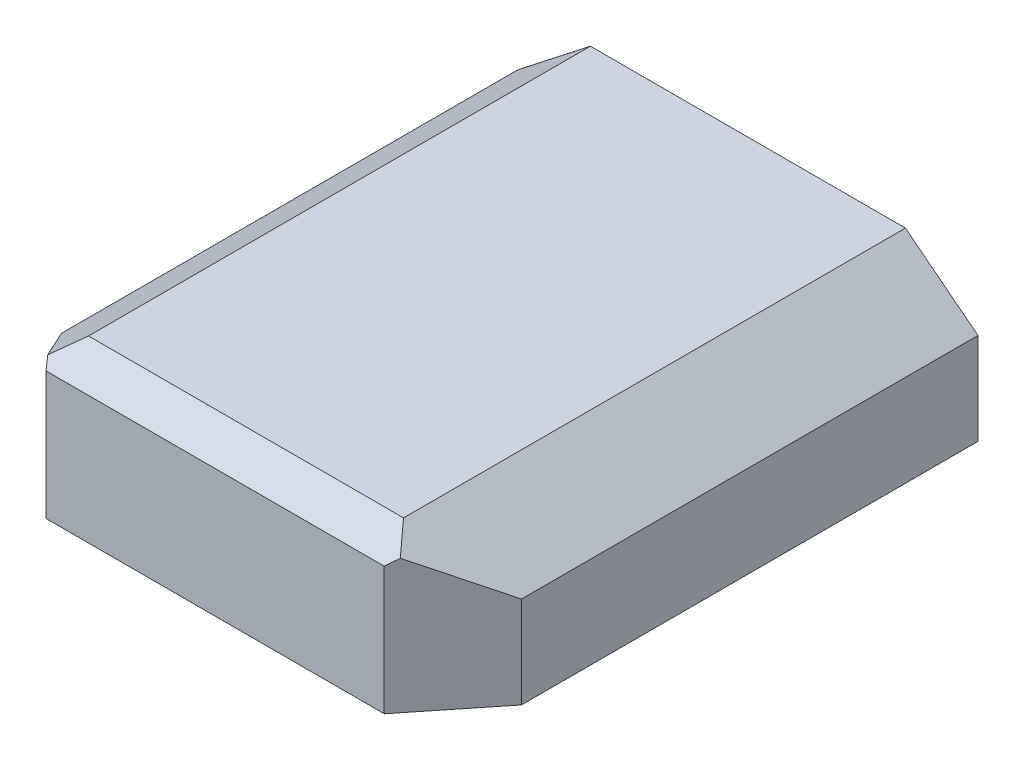
ISO-10303-21;
HEADER;
FILE_DESCRIPTION(('STEP AP214'),'2;1');
FILE_NAME('part.step','',(''),(''),'','','');
FILE_SCHEMA(('AUTOMOTIVE_DESIGN { 1 0 10303 214 1 1 1 1 }'));
ENDSEC;
DATA;
#1=APPLICATION_CONTEXT('core data for automotive mechanical design processes');
#2=APPLICATION_PROTOCOL_DEFINITION('international standard','automotive_design',2000,#1);
#3=PRODUCT_CONTEXT('',#1,'mechanical');
#4=PRODUCT('Part','Part','',(#3));
#5=PRODUCT_RELATED_PRODUCT_CATEGORY('part','',(#4));
#6=PRODUCT_DEFINITION_FORMATION('','',#4);
#7=PRODUCT_DEFINITION_CONTEXT('part definition',#1,'design');
#8=PRODUCT_DEFINITION('design','',#6,#7);
#9=PRODUCT_DEFINITION_SHAPE('','',#8);
#10=(LENGTH_UNIT() NAMED_UNIT(*) SI_UNIT(.MILLI.,.METRE.));
#11=(NAMED_UNIT(*) PLANE_ANGLE_UNIT() SI_UNIT($,.RADIAN.));
#12=(NAMED_UNIT(*) SI_UNIT($,.STERADIAN.) SOLID_ANGLE_UNIT());
#13=UNCERTAINTY_MEASURE_WITH_UNIT(LENGTH_MEASURE(1.E-05),#10,'distance_accuracy_value','');
#14=(GEOMETRIC_REPRESENTATION_CONTEXT(3) GLOBAL_UNCERTAINTY_ASSIGNED_CONTEXT((#13)) GLOBAL_UNIT_ASSIGNED_CONTEXT((#10,
#11,#12)) REPRESENTATION_CONTEXT('',''));
#15=CARTESIAN_POINT('',(0.,0.,0.));
#16=DIRECTION('',(0.,0.,1.));
#17=DIRECTION('',(1.,0.,0.));
#18=AXIS2_PLACEMENT_3D('',#15,#16,#17);
#19=CARTESIAN_POINT('',(-55.8644439331409,39.7381544763765,166.540565478371));
#20=DIRECTION('',(0.,-0.554700196225229,0.832050294337843));
#21=DIRECTION('',(0.,-0.832050294337843,-0.554700196225229));
#22=AXIS2_PLACEMENT_3D('',#19,#20,#21);
#23=PLANE('',#22);
#24=DIRECTION('',(-0.570340989878508,0.683452794913705,0.455635196609138));
#25=VECTOR('',#24,1.);
#26=CARTESIAN_POINT('',(-54.4589959227059,40.5501245133977,167.081878836385));
#27=LINE('',#26,#25);
#28=CARTESIAN_POINT('',(-55.858603187478,42.2273062588195,168.2));
#29=VERTEX_POINT('',#28);
#30=CARTESIAN_POINT('',(-55.8644439331409,42.2343053593901,168.204666067047));
#31=VERTEX_POINT('',#30);
#32=EDGE_CURVE('E308',#29,#31,#27,.T.);
#33=ORIENTED_EDGE('',*,*,#32,.F.);
#34=DIRECTION('',(1.,0.,0.));
#35=VECTOR('',#34,1.);
#36=CARTESIAN_POINT('',(-55.8644439331409,42.2273062588195,168.2));
#37=LINE('',#36,#35);
#38=CARTESIAN_POINT('',(55.8586031874781,42.2273062588196,168.2));
#39=VERTEX_POINT('',#38);
#40=EDGE_CURVE('E274',#29,#39,#37,.T.);
#41=ORIENTED_EDGE('',*,*,#40,.T.);
#42=DIRECTION('',(-0.570340989878508,-0.683452794913706,-0.455635196609137));
#43=VECTOR('',#42,1.);
#44=CARTESIAN_POINT('',(18.1148350650901,-3.00192374850611,138.047179995116));
#45=LINE('',#44,#43);
#46=CARTESIAN_POINT('',(55.8644439331409,42.2343053593901,168.204666067047));
#47=VERTEX_POINT('',#46);
#48=EDGE_CURVE('E293',#47,#39,#45,.T.);
#49=ORIENTED_EDGE('',*,*,#48,.F.);
#50=DIRECTION('',(1.,0.,0.));
#51=VECTOR('',#50,1.);
#52=CARTESIAN_POINT('',(-55.8644439331409,42.2343053593901,168.204666067047));
#53=LINE('',#52,#51);
#54=EDGE_CURVE('E310',#31,#47,#53,.T.);
#55=ORIENTED_EDGE('',*,*,#54,.F.);
#56=EDGE_LOOP('',(#33,#41,#49,#55));
#57=FACE_BOUND('',#56,.T.);
#58=ADVANCED_FACE('F35',(#57),#23,.T.);
#59=CARTESIAN_POINT('',(-53.5205598674082,42.2343053593901,166.332179088079));
#60=DIRECTION('',(0.624162326322625,0.,0.781294688577575));
#61=DIRECTION('',(0.781294688577575,0.,-0.624162326322625));
#62=AXIS2_PLACEMENT_3D('',#59,#60,#61);
#63=PLANE('',#62);
#64=DIRECTION('',(-0.781294688577575,0.,0.624162326322625));
#65=VECTOR('',#64,1.);
#66=CARTESIAN_POINT('',(-53.5205598674082,0.,166.332179088079));
#67=LINE('',#66,#65);
#68=CARTESIAN_POINT('',(-55.858603187478,0.,168.2));
#69=VERTEX_POINT('',#68);
#70=CARTESIAN_POINT('',(-55.8644439331409,0.,168.204666067047));
#71=VERTEX_POINT('',#70);
#72=EDGE_CURVE('E300',#69,#71,#67,.T.);
#73=ORIENTED_EDGE('',*,*,#72,.F.);
#74=DIRECTION('',(0.,1.,0.));
#75=VECTOR('',#74,1.);
#76=CARTESIAN_POINT('',(-55.858603187478,42.2343053593901,168.2));
#77=LINE('',#76,#75);
#78=EDGE_CURVE('E277',#69,#29,#77,.T.);
#79=ORIENTED_EDGE('',*,*,#78,.T.);
#80=ORIENTED_EDGE('',*,*,#32,.T.);
#81=DIRECTION('',(0.,1.,0.));
#82=VECTOR('',#81,1.);
#83=CARTESIAN_POINT('',(-55.8644439331409,42.2343053593901,168.204666067047));
#84=LINE('',#83,#82);
#85=EDGE_CURVE('E296',#71,#31,#84,.T.);
#86=ORIENTED_EDGE('',*,*,#85,.F.);
#87=EDGE_LOOP('',(#73,#79,#80,#86));
#88=FACE_BOUND('',#87,.T.);
#89=ADVANCED_FACE('F472',(#88),#63,.T.);
#90=CARTESIAN_POINT('',(53.5205598674082,42.2343053593901,166.332179088079));
#91=DIRECTION('',(-0.624162326322625,0.,0.781294688577575));
#92=DIRECTION('',(0.781294688577575,0.,0.624162326322625));
#93=AXIS2_PLACEMENT_3D('',#90,#91,#92);
#94=PLANE('',#93);
#95=ORIENTED_EDGE('',*,*,#48,.T.);
#96=DIRECTION('',(0.,-1.,0.));
#97=VECTOR('',#96,1.);
#98=CARTESIAN_POINT('',(55.8586031874781,42.2343053593901,168.2));
#99=LINE('',#98,#97);
#100=CARTESIAN_POINT('',(55.8586031874781,0.,168.2));
#101=VERTEX_POINT('',#100);
#102=EDGE_CURVE('E11',#39,#101,#99,.T.);
#103=ORIENTED_EDGE('',*,*,#102,.T.);
#104=DIRECTION('',(0.781294688577575,0.,0.624162326322625));
#105=VECTOR('',#104,1.);
#106=CARTESIAN_POINT('',(53.5205598674082,0.,166.332179088079));
#107=LINE('',#106,#105);
#108=CARTESIAN_POINT('',(55.8644439331409,0.,168.204666067047));
#109=VERTEX_POINT('',#108);
#110=EDGE_CURVE('E283',#101,#109,#107,.T.);
#111=ORIENTED_EDGE('',*,*,#110,.T.);
#112=DIRECTION('',(0.,-1.,0.));
#113=VECTOR('',#112,1.);
#114=CARTESIAN_POINT('',(55.8644439331409,42.2343053593901,168.204666067047));
#115=LINE('',#114,#113);
#116=EDGE_CURVE('E280',#47,#109,#115,.T.);
#117=ORIENTED_EDGE('',*,*,#116,.F.);
#118=EDGE_LOOP('',(#95,#103,#111,#117));
#119=FACE_BOUND('',#118,.T.);
#120=ADVANCED_FACE('F465',(#119),#94,.T.);
#121=CARTESIAN_POINT('',(73.,0.,-4.80000000000001));
#122=DIRECTION('',(-1.,0.,0.));
#123=DIRECTION('',(0.,-1.,0.));
#124=AXIS2_PLACEMENT_3D('',#121,#122,#123);
#125=PLANE('',#124);
#126=DIRECTION('',(0.,0.,1.));
#127=VECTOR('',#126,1.);
#128=CARTESIAN_POINT('',(73.,0.,-4.80000000000001));
#129=LINE('',#128,#127);
#130=CARTESIAN_POINT('',(73.,0.,-4.80000000000001));
#131=VERTEX_POINT('',#130);
#132=CARTESIAN_POINT('',(73.,0.,141.948805612583));
#133=VERTEX_POINT('',#132);
#134=EDGE_CURVE('E209',#131,#133,#129,.T.);
#135=ORIENTED_EDGE('',*,*,#134,.T.);
#136=DIRECTION('',(0.,1.,0.));
#137=VECTOR('',#136,1.);
#138=CARTESIAN_POINT('',(73.,-1.58921593677276E-13,141.948805612583));
#139=LINE('',#138,#137);
#140=CARTESIAN_POINT('',(73.,28.8374160707548,141.948805612583));
#141=VERTEX_POINT('',#140);
#142=EDGE_CURVE('E290',#133,#141,#139,.T.);
#143=ORIENTED_EDGE('',*,*,#142,.T.);
#144=DIRECTION('',(0.,0.,1.));
#145=VECTOR('',#144,1.);
#146=CARTESIAN_POINT('',(73.,28.8374160707548,-4.80000000000001));
#147=LINE('',#146,#145);
#148=CARTESIAN_POINT('',(73.,28.8374160707548,-4.80000000000001));
#149=VERTEX_POINT('',#148);
#150=EDGE_CURVE('E365',#149,#141,#147,.T.);
#151=ORIENTED_EDGE('',*,*,#150,.F.);
#152=DIRECTION('',(0.,-1.,0.));
#153=VECTOR('',#152,1.);
#154=CARTESIAN_POINT('',(73.,0.,-4.80000000000001));
#155=LINE('',#154,#153);
#156=EDGE_CURVE('E351',#149,#131,#155,.T.);
#157=ORIENTED_EDGE('',*,*,#156,.T.);
#158=EDGE_LOOP('',(#135,#143,#151,#157));
#159=FACE_BOUND('',#158,.T.);
#160=ADVANCED_FACE('F414',(#159),#125,.T.);
#161=CARTESIAN_POINT('',(73.,28.8374160707548,-4.80000000000001));
#162=DIRECTION('',(-0.615921966397541,-0.787807166322436,0.));
#163=DIRECTION('',(0.787807166322436,-0.615921966397541,0.));
#164=AXIS2_PLACEMENT_3D('',#161,#162,#163);
#165=PLANE('',#164);
#166=ORIENTED_EDGE('',*,*,#150,.T.);
#167=DIRECTION('',(-0.560938368809676,0.438551815614838,0.702154150751862));
#168=VECTOR('',#167,1.);
#169=CARTESIAN_POINT('',(130.799248255789,-16.3510871110442,69.598643224405));
#170=LINE('',#169,#168);
#171=CARTESIAN_POINT('',(56.1126975061143,42.0402162023382,163.087472889429));
#172=VERTEX_POINT('',#171);
#173=EDGE_CURVE('E287',#141,#172,#170,.T.);
#174=ORIENTED_EDGE('',*,*,#173,.T.);
#175=DIRECTION('',(0.57865090581217,-0.452399799089515,0.678599698634269));
#176=VECTOR('',#175,1.);
#177=CARTESIAN_POINT('',(-0.701326648635481,86.458453268779,96.4601172897677));
#178=LINE('',#177,#176);
#179=CARTESIAN_POINT('',(51.,46.0374160707548,157.091673086804));
#180=VERTEX_POINT('',#179);
#181=EDGE_CURVE('E315',#180,#172,#178,.T.);
#182=ORIENTED_EDGE('',*,*,#181,.F.);
#183=DIRECTION('',(0.,0.,1.));
#184=VECTOR('',#183,1.);
#185=CARTESIAN_POINT('',(51.,46.0374160707548,-4.80000000000001));
#186=LINE('',#185,#184);
#187=CARTESIAN_POINT('',(51.,46.0374160707548,-4.80000000000001));
#188=VERTEX_POINT('',#187);
#189=EDGE_CURVE('E368',#188,#180,#186,.T.);
#190=ORIENTED_EDGE('',*,*,#189,.F.);
#191=DIRECTION('',(0.787807166322436,-0.615921966397541,0.));
#192=VECTOR('',#191,1.);
#193=CARTESIAN_POINT('',(73.,28.8374160707548,-4.80000000000001));
#194=LINE('',#193,#192);
#195=EDGE_CURVE('E348',#188,#149,#194,.T.);
#196=ORIENTED_EDGE('',*,*,#195,.T.);
#197=EDGE_LOOP('',(#166,#174,#182,#190,#196));
#198=FACE_BOUND('',#197,.T.);
#199=ADVANCED_FACE('F406',(#198),#165,.T.);
#200=CARTESIAN_POINT('',(-52.0335375839183,49.0374160707548,-4.80000000000001));
#201=DIRECTION('',(-0.615921966397541,0.787807166322436,0.));
#202=DIRECTION('',(-0.787807166322436,-0.615921966397541,0.));
#203=AXIS2_PLACEMENT_3D('',#200,#201,#202);
#204=PLANE('',#203);
#205=DIRECTION('',(-0.560938368809677,-0.438551815614838,-0.702154150751862));
#206=VECTOR('',#205,1.);
#207=CARTESIAN_POINT('',(-122.062770850796,-5.71271175607726,85.3409637378674));
#208=LINE('',#207,#206);
#209=CARTESIAN_POINT('',(-58.2204402860258,44.2003830491071,165.255549532472));
#210=VERTEX_POINT('',#209);
#211=CARTESIAN_POINT('',(-76.,30.3,143.));
#212=VERTEX_POINT('',#211);
#213=EDGE_CURVE('E321',#210,#212,#208,.T.);
#214=ORIENTED_EDGE('',*,*,#213,.F.);
#215=DIRECTION('',(-0.578650905812169,-0.452399799089514,0.678599698634271));
#216=VECTOR('',#215,1.);
#217=CARTESIAN_POINT('',(11.8935177886915,99.0167502711588,83.0309986993939));
#218=LINE('',#217,#216);
#219=CARTESIAN_POINT('',(-52.0335375839183,49.0374160707548,158.));
#220=VERTEX_POINT('',#219);
#221=EDGE_CURVE('E336',#220,#210,#218,.T.);
#222=ORIENTED_EDGE('',*,*,#221,.F.);
#223=DIRECTION('',(0.,0.,1.));
#224=VECTOR('',#223,1.);
#225=CARTESIAN_POINT('',(-52.0335375839183,49.0374160707548,-4.80000000000001));
#226=LINE('',#225,#224);
#227=CARTESIAN_POINT('',(-52.0335375839183,49.0374160707548,-7.80000000000001));
#228=VERTEX_POINT('',#227);
#229=EDGE_CURVE('E355',#228,#220,#226,.T.);
#230=ORIENTED_EDGE('',*,*,#229,.F.);
#231=DIRECTION('',(0.787807166322436,0.615921966397541,0.));
#232=VECTOR('',#231,1.);
#233=CARTESIAN_POINT('',(-52.0335375839183,49.0374160707548,-7.80000000000001));
#234=LINE('',#233,#232);
#235=CARTESIAN_POINT('',(-76.,30.3,-7.80000000000001));
#236=VERTEX_POINT('',#235);
#237=EDGE_CURVE('E243',#236,#228,#234,.T.);
#238=ORIENTED_EDGE('',*,*,#237,.F.);
#239=DIRECTION('',(0.,0.,1.));
#240=VECTOR('',#239,1.);
#241=CARTESIAN_POINT('',(-76.,30.3,-4.80000000000001));
#242=LINE('',#241,#240);
#243=EDGE_CURVE('E354',#236,#212,#242,.T.);
#244=ORIENTED_EDGE('',*,*,#243,.T.);
#245=EDGE_LOOP('',(#214,#222,#230,#238,#244));
#246=FACE_BOUND('',#245,.T.);
#247=ADVANCED_FACE('F37',(#246),#204,.T.);
#248=CARTESIAN_POINT('',(52.0335375839183,49.0374160707548,-4.80000000000001));
#249=DIRECTION('',(0.,1.,0.));
#250=DIRECTION('',(-1.,0.,0.));
#251=AXIS2_PLACEMENT_3D('',#248,#249,#250);
#252=PLANE('',#251);
#253=DIRECTION('',(1.,0.,0.));
#254=VECTOR('',#253,1.);
#255=CARTESIAN_POINT('',(-76.,49.0374160707548,158.));
#256=LINE('',#255,#254);
#257=CARTESIAN_POINT('',(52.0335375839183,49.0374160707548,158.));
#258=VERTEX_POINT('',#257);
#259=EDGE_CURVE('E331',#220,#258,#256,.T.);
#260=ORIENTED_EDGE('',*,*,#259,.T.);
#261=DIRECTION('',(0.,0.,1.));
#262=VECTOR('',#261,1.);
#263=CARTESIAN_POINT('',(52.0335375839183,49.0374160707548,-4.80000000000001));
#264=LINE('',#263,#262);
#265=CARTESIAN_POINT('',(52.0335375839183,49.0374160707548,-7.80000000000001));
#266=VERTEX_POINT('',#265);
#267=EDGE_CURVE('E359',#266,#258,#264,.T.);
#268=ORIENTED_EDGE('',*,*,#267,.F.);
#269=DIRECTION('',(1.,0.,0.));
#270=VECTOR('',#269,1.);
#271=CARTESIAN_POINT('',(52.0335375839183,49.0374160707548,-7.80000000000001));
#272=LINE('',#271,#270);
#273=EDGE_CURVE('E246',#228,#266,#272,.T.);
#274=ORIENTED_EDGE('',*,*,#273,.F.);
#275=ORIENTED_EDGE('',*,*,#229,.T.);
#276=EDGE_LOOP('',(#260,#268,#274,#275));
#277=FACE_BOUND('',#276,.T.);
#278=ADVANCED_FACE('F450',(#277),#252,.T.);
#279=CARTESIAN_POINT('',(52.0335375839183,49.0374160707548,-4.80000000000001));
#280=DIRECTION('',(0.615921966397541,0.787807166322436,0.));
#281=DIRECTION('',(-0.787807166322436,0.615921966397541,0.));
#282=AXIS2_PLACEMENT_3D('',#279,#280,#281);
#283=PLANE('',#282);
#284=DIRECTION('',(-0.560938368809676,0.438551815614838,0.702154150751862));
#285=VECTOR('',#284,1.);
#286=CARTESIAN_POINT('',(122.062770850797,-5.71271175607724,85.3409637378673));
#287=LINE('',#286,#285);
#288=CARTESIAN_POINT('',(76.,30.3,143.));
#289=VERTEX_POINT('',#288);
#290=CARTESIAN_POINT('',(58.2204402860258,44.2003830491071,165.255549532472));
#291=VERTEX_POINT('',#290);
#292=EDGE_CURVE('E329',#289,#291,#287,.T.);
#293=ORIENTED_EDGE('',*,*,#292,.F.);
#294=DIRECTION('',(0.,0.,1.));
#295=VECTOR('',#294,1.);
#296=CARTESIAN_POINT('',(76.,30.3,-4.80000000000001));
#297=LINE('',#296,#295);
#298=CARTESIAN_POINT('',(76.,30.3,-7.80000000000001));
#299=VERTEX_POINT('',#298);
#300=EDGE_CURVE('E208',#299,#289,#297,.T.);
#301=ORIENTED_EDGE('',*,*,#300,.F.);
#302=DIRECTION('',(0.787807166322436,-0.615921966397541,0.));
#303=VECTOR('',#302,1.);
#304=CARTESIAN_POINT('',(76.,30.3,-7.80000000000001));
#305=LINE('',#304,#303);
#306=EDGE_CURVE('E225',#266,#299,#305,.T.);
#307=ORIENTED_EDGE('',*,*,#306,.F.);
#308=ORIENTED_EDGE('',*,*,#267,.T.);
#309=DIRECTION('',(-0.578650905812169,0.452399799089514,-0.678599698634271));
#310=VECTOR('',#309,1.);
#311=CARTESIAN_POINT('',(-11.8935177886915,99.0167502711588,83.0309986993939));
#312=LINE('',#311,#310);
#313=EDGE_CURVE('E334',#291,#258,#312,.T.);
#314=ORIENTED_EDGE('',*,*,#313,.F.);
#315=EDGE_LOOP('',(#293,#301,#307,#308,#314));
#316=FACE_BOUND('',#315,.T.);
#317=ADVANCED_FACE('F454',(#316),#283,.T.);
#318=CARTESIAN_POINT('',(76.,30.3,-4.80000000000001));
#319=DIRECTION('',(1.,0.,0.));
#320=DIRECTION('',(0.,1.,0.));
#321=AXIS2_PLACEMENT_3D('',#318,#319,#320);
#322=PLANE('',#321);
#323=DIRECTION('',(0.,1.,0.));
#324=VECTOR('',#323,1.);
#325=CARTESIAN_POINT('',(76.,-1.2E-05,143.));
#326=LINE('',#325,#324);
#327=CARTESIAN_POINT('',(76.,0.,143.));
#328=VERTEX_POINT('',#327);
#329=EDGE_CURVE('E205',#328,#289,#326,.T.);
#330=ORIENTED_EDGE('',*,*,#329,.F.);
#331=DIRECTION('',(0.,0.,1.));
#332=VECTOR('',#331,1.);
#333=CARTESIAN_POINT('',(76.,0.,-4.80000000000001));
#334=LINE('',#333,#332);
#335=CARTESIAN_POINT('',(76.,0.,-7.80000000000001));
#336=VERTEX_POINT('',#335);
#337=EDGE_CURVE('E199',#336,#328,#334,.T.);
#338=ORIENTED_EDGE('',*,*,#337,.F.);
#339=DIRECTION('',(0.,-1.,0.));
#340=VECTOR('',#339,1.);
#341=CARTESIAN_POINT('',(76.,0.,-7.80000000000001));
#342=LINE('',#341,#340);
#343=EDGE_CURVE('E204',#299,#336,#342,.T.);
#344=ORIENTED_EDGE('',*,*,#343,.F.);
#345=ORIENTED_EDGE('',*,*,#300,.T.);
#346=EDGE_LOOP('',(#330,#338,#344,#345));
#347=FACE_BOUND('',#346,.T.);
#348=ADVANCED_FACE('F201',(#347),#322,.T.);
#349=CARTESIAN_POINT('',(76.,0.,-4.80000000000001));
#350=DIRECTION('',(0.,-1.,0.));
#351=DIRECTION('',(1.,0.,0.));
#352=AXIS2_PLACEMENT_3D('',#349,#350,#351);
#353=PLANE('',#352);
#354=DIRECTION('',(-1.,0.,0.));
#355=VECTOR('',#354,1.);
#356=CARTESIAN_POINT('',(55.8644439331409,0.,165.2));
#357=LINE('',#356,#355);
#358=CARTESIAN_POINT('',(54.4250374528322,0.,165.2));
#359=VERTEX_POINT('',#358);
#360=CARTESIAN_POINT('',(-54.4250374528323,0.,165.2));
#361=VERTEX_POINT('',#360);
#362=EDGE_CURVE('E267',#359,#361,#357,.T.);
#363=ORIENTED_EDGE('',*,*,#362,.F.);
#364=DIRECTION('',(0.624162326322624,0.,-0.781294688577575));
#365=VECTOR('',#364,1.);
#366=CARTESIAN_POINT('',(53.5205598674082,0.,166.332179088079));
#367=LINE('',#366,#365);
#368=EDGE_CURVE('E281',#359,#133,#367,.T.);
#369=ORIENTED_EDGE('',*,*,#368,.T.);
#370=ORIENTED_EDGE('',*,*,#134,.F.);
#371=DIRECTION('',(-1.,0.,0.));
#372=VECTOR('',#371,1.);
#373=CARTESIAN_POINT('',(42.425,0.,-4.80000000000001));
#374=LINE('',#373,#372);
#375=CARTESIAN_POINT('',(42.425,0.,-4.80000000000001));
#376=VERTEX_POINT('',#375);
#377=EDGE_CURVE('E250',#131,#376,#374,.T.);
#378=ORIENTED_EDGE('',*,*,#377,.T.);
#379=DIRECTION('',(0.,0.,1.));
#380=VECTOR('',#379,1.);
#381=CARTESIAN_POINT('',(42.425,0.,-7.80000000000001));
#382=LINE('',#381,#380);
#383=CARTESIAN_POINT('',(42.425,0.,-7.80000000000001));
#384=VERTEX_POINT('',#383);
#385=EDGE_CURVE('E216',#384,#376,#382,.T.);
#386=ORIENTED_EDGE('',*,*,#385,.F.);
#387=DIRECTION('',(-1.,0.,0.));
#388=VECTOR('',#387,1.);
#389=CARTESIAN_POINT('',(42.425,0.,-7.80000000000001));
#390=LINE('',#389,#388);
#391=EDGE_CURVE('E212',#336,#384,#390,.T.);
#392=ORIENTED_EDGE('',*,*,#391,.F.);
#393=ORIENTED_EDGE('',*,*,#337,.T.);
#394=DIRECTION('',(0.624162326322624,0.,-0.781294688577575));
#395=VECTOR('',#394,1.);
#396=CARTESIAN_POINT('',(148.075366192108,0.,52.7797184989494));
#397=LINE('',#396,#395);
#398=EDGE_CURVE('E327',#109,#328,#397,.T.);
#399=ORIENTED_EDGE('',*,*,#398,.F.);
#400=ORIENTED_EDGE('',*,*,#110,.F.);
#401=DIRECTION('',(-1.,0.,0.));
#402=VECTOR('',#401,1.);
#403=CARTESIAN_POINT('',(55.8644439331409,0.,168.2));
#404=LINE('',#403,#402);
#405=EDGE_CURVE('E266',#101,#69,#404,.T.);
#406=ORIENTED_EDGE('',*,*,#405,.T.);
#407=ORIENTED_EDGE('',*,*,#72,.T.);
#408=DIRECTION('',(0.624162326322625,0.,0.781294688577575));
#409=VECTOR('',#408,1.);
#410=CARTESIAN_POINT('',(-148.075366192108,0.,52.7797184989495));
#411=LINE('',#410,#409);
#412=CARTESIAN_POINT('',(-76.,0.,143.));
#413=VERTEX_POINT('',#412);
#414=EDGE_CURVE('E323',#413,#71,#411,.T.);
#415=ORIENTED_EDGE('',*,*,#414,.F.);
#416=DIRECTION('',(0.,0.,1.));
#417=VECTOR('',#416,1.);
#418=CARTESIAN_POINT('',(-76.,0.,-4.80000000000001));
#419=LINE('',#418,#417);
#420=CARTESIAN_POINT('',(-76.,0.,-7.80000000000001));
#421=VERTEX_POINT('',#420);
#422=EDGE_CURVE('E379',#421,#413,#419,.T.);
#423=ORIENTED_EDGE('',*,*,#422,.F.);
#424=DIRECTION('',(-1.,0.,0.));
#425=VECTOR('',#424,1.);
#426=CARTESIAN_POINT('',(-76.,0.,-7.80000000000001));
#427=LINE('',#426,#425);
#428=CARTESIAN_POINT('',(-42.425,0.,-7.80000000000001));
#429=VERTEX_POINT('',#428);
#430=EDGE_CURVE('E237',#429,#421,#427,.T.);
#431=ORIENTED_EDGE('',*,*,#430,.F.);
#432=DIRECTION('',(0.,0.,1.));
#433=VECTOR('',#432,1.);
#434=CARTESIAN_POINT('',(-42.425,0.,-7.80000000000001));
#435=LINE('',#434,#433);
#436=CARTESIAN_POINT('',(-42.425,0.,-4.80000000000001));
#437=VERTEX_POINT('',#436);
#438=EDGE_CURVE('E249',#429,#437,#435,.T.);
#439=ORIENTED_EDGE('',*,*,#438,.T.);
#440=DIRECTION('',(-1.,0.,0.));
#441=VECTOR('',#440,1.);
#442=CARTESIAN_POINT('',(-76.,0.,-4.80000000000001));
#443=LINE('',#442,#441);
#444=CARTESIAN_POINT('',(-73.,0.,-4.80000000000001));
#445=VERTEX_POINT('',#444);
#446=EDGE_CURVE('E226',#437,#445,#443,.T.);
#447=ORIENTED_EDGE('',*,*,#446,.T.);
#448=DIRECTION('',(0.,0.,1.));
#449=VECTOR('',#448,1.);
#450=CARTESIAN_POINT('',(-73.,0.,-4.80000000000001));
#451=LINE('',#450,#449);
#452=CARTESIAN_POINT('',(-73.,0.,141.948805612583));
#453=VERTEX_POINT('',#452);
#454=EDGE_CURVE('E376',#445,#453,#451,.T.);
#455=ORIENTED_EDGE('',*,*,#454,.T.);
#456=DIRECTION('',(0.624162326322625,0.,0.781294688577575));
#457=VECTOR('',#456,1.);
#458=CARTESIAN_POINT('',(-53.5205598674082,0.,166.332179088079));
#459=LINE('',#458,#457);
#460=EDGE_CURVE('E297',#453,#361,#459,.T.);
#461=ORIENTED_EDGE('',*,*,#460,.T.);
#462=EDGE_LOOP('',(#363,#369,#370,#378,#386,#392,#393,#399,#400,#406,#407,#415,#423,#431,#439,
#447,#455,#461));
#463=FACE_BOUND('',#462,.T.);
#464=ADVANCED_FACE('F214',(#463),#353,.T.);
#465=CARTESIAN_POINT('',(-51.,46.0374160707548,-4.80000000000001));
#466=DIRECTION('',(0.,-1.,0.));
#467=DIRECTION('',(1.,0.,0.));
#468=AXIS2_PLACEMENT_3D('',#465,#466,#467);
#469=PLANE('',#468);
#470=DIRECTION('',(1.,0.,0.));
#471=VECTOR('',#470,1.);
#472=CARTESIAN_POINT('',(-50.9999999999995,46.0374160707548,157.091673086804));
#473=LINE('',#472,#471);
#474=CARTESIAN_POINT('',(-51.,46.0374160707548,157.091673086804));
#475=VERTEX_POINT('',#474);
#476=EDGE_CURVE('E313',#475,#180,#473,.T.);
#477=ORIENTED_EDGE('',*,*,#476,.F.);
#478=DIRECTION('',(0.,0.,1.));
#479=VECTOR('',#478,1.);
#480=CARTESIAN_POINT('',(-51.,46.0374160707548,-4.80000000000001));
#481=LINE('',#480,#479);
#482=CARTESIAN_POINT('',(-51.,46.0374160707548,-4.80000000000001));
#483=VERTEX_POINT('',#482);
#484=EDGE_CURVE('E371',#483,#475,#481,.T.);
#485=ORIENTED_EDGE('',*,*,#484,.F.);
#486=DIRECTION('',(1.,0.,0.));
#487=VECTOR('',#486,1.);
#488=CARTESIAN_POINT('',(-51.,46.0374160707548,-4.80000000000001));
#489=LINE('',#488,#487);
#490=EDGE_CURVE('E345',#483,#188,#489,.T.);
#491=ORIENTED_EDGE('',*,*,#490,.T.);
#492=ORIENTED_EDGE('',*,*,#189,.T.);
#493=EDGE_LOOP('',(#477,#485,#491,#492));
#494=FACE_BOUND('',#493,.T.);
#495=ADVANCED_FACE('F408',(#494),#469,.T.);
#496=CARTESIAN_POINT('',(-73.,28.8374160707548,-4.80000000000001));
#497=DIRECTION('',(0.615921966397541,-0.787807166322436,0.));
#498=DIRECTION('',(0.787807166322436,0.615921966397541,0.));
#499=AXIS2_PLACEMENT_3D('',#496,#497,#498);
#500=PLANE('',#499);
#501=DIRECTION('',(0.560938368809677,0.438551815614838,0.702154150751862));
#502=VECTOR('',#501,1.);
#503=CARTESIAN_POINT('',(-130.799248255789,-16.3510871110443,69.5986432244052));
#504=LINE('',#503,#502);
#505=CARTESIAN_POINT('',(-73.,28.8374160707548,141.948805612583));
#506=VERTEX_POINT('',#505);
#507=CARTESIAN_POINT('',(-56.1126975061142,42.0402162023383,163.087472889429));
#508=VERTEX_POINT('',#507);
#509=EDGE_CURVE('E58',#506,#508,#504,.T.);
#510=ORIENTED_EDGE('',*,*,#509,.F.);
#511=DIRECTION('',(0.,0.,1.));
#512=VECTOR('',#511,1.);
#513=CARTESIAN_POINT('',(-73.,28.8374160707548,-4.80000000000001));
#514=LINE('',#513,#512);
#515=CARTESIAN_POINT('',(-73.,28.8374160707548,-4.80000000000001));
#516=VERTEX_POINT('',#515);
#517=EDGE_CURVE('E374',#516,#506,#514,.T.);
#518=ORIENTED_EDGE('',*,*,#517,.F.);
#519=DIRECTION('',(0.787807166322436,0.615921966397541,0.));
#520=VECTOR('',#519,1.);
#521=CARTESIAN_POINT('',(-73.,28.8374160707548,-4.80000000000001));
#522=LINE('',#521,#520);
#523=EDGE_CURVE('E342',#516,#483,#522,.T.);
#524=ORIENTED_EDGE('',*,*,#523,.T.);
#525=ORIENTED_EDGE('',*,*,#484,.T.);
#526=DIRECTION('',(0.578650905812169,0.452399799089514,-0.678599698634271));
#527=VECTOR('',#526,1.);
#528=CARTESIAN_POINT('',(0.701326648635675,86.4584532687791,96.4601172897674));
#529=LINE('',#528,#527);
#530=EDGE_CURVE('E389',#508,#475,#529,.T.);
#531=ORIENTED_EDGE('',*,*,#530,.F.);
#532=EDGE_LOOP('',(#510,#518,#524,#525,#531));
#533=FACE_BOUND('',#532,.T.);
#534=ADVANCED_FACE('F421',(#533),#500,.T.);
#535=CARTESIAN_POINT('',(-73.,0.,-4.80000000000001));
#536=DIRECTION('',(1.,0.,0.));
#537=DIRECTION('',(0.,0.,-1.));
#538=AXIS2_PLACEMENT_3D('',#535,#536,#537);
#539=PLANE('',#538);
#540=DIRECTION('',(0.,1.,0.));
#541=VECTOR('',#540,1.);
#542=CARTESIAN_POINT('',(-73.,0.,141.948805612583));
#543=LINE('',#542,#541);
#544=EDGE_CURVE('E305',#453,#506,#543,.T.);
#545=ORIENTED_EDGE('',*,*,#544,.F.);
#546=ORIENTED_EDGE('',*,*,#454,.F.);
#547=DIRECTION('',(0.,1.,0.));
#548=VECTOR('',#547,1.);
#549=CARTESIAN_POINT('',(-73.,0.,-4.80000000000001));
#550=LINE('',#549,#548);
#551=EDGE_CURVE('E339',#445,#516,#550,.T.);
#552=ORIENTED_EDGE('',*,*,#551,.T.);
#553=ORIENTED_EDGE('',*,*,#517,.T.);
#554=EDGE_LOOP('',(#545,#546,#552,#553));
#555=FACE_BOUND('',#554,.T.);
#556=ADVANCED_FACE('F424',(#555),#539,.T.);
#557=CARTESIAN_POINT('',(-76.,30.3,-4.80000000000001));
#558=DIRECTION('',(-1.,0.,0.));
#559=DIRECTION('',(0.,0.,1.));
#560=AXIS2_PLACEMENT_3D('',#557,#558,#559);
#561=PLANE('',#560);
#562=DIRECTION('',(0.,1.,0.));
#563=VECTOR('',#562,1.);
#564=CARTESIAN_POINT('',(-76.,-1.2E-05,143.));
#565=LINE('',#564,#563);
#566=EDGE_CURVE('E318',#413,#212,#565,.T.);
#567=ORIENTED_EDGE('',*,*,#566,.T.);
#568=ORIENTED_EDGE('',*,*,#243,.F.);
#569=DIRECTION('',(0.,1.,0.));
#570=VECTOR('',#569,1.);
#571=CARTESIAN_POINT('',(-76.,30.3,-7.80000000000001));
#572=LINE('',#571,#570);
#573=EDGE_CURVE('E240',#421,#236,#572,.T.);
#574=ORIENTED_EDGE('',*,*,#573,.F.);
#575=ORIENTED_EDGE('',*,*,#422,.T.);
#576=EDGE_LOOP('',(#567,#568,#574,#575));
#577=FACE_BOUND('',#576,.T.);
#578=ADVANCED_FACE('F444',(#577),#561,.T.);
#579=CARTESIAN_POINT('',(-76.,49.0374160707548,158.));
#580=DIRECTION('',(0.,-0.832050294337844,-0.554700196225229));
#581=DIRECTION('',(0.,0.554700196225229,-0.832050294337844));
#582=AXIS2_PLACEMENT_3D('',#579,#580,#581);
#583=PLANE('',#582);
#584=ORIENTED_EDGE('',*,*,#54,.T.);
#585=DIRECTION('',(0.553571601071743,0.461955203451546,-0.692932805177319));
#586=VECTOR('',#585,1.);
#587=CARTESIAN_POINT('',(21.1098176860657,13.2315884429757,211.708741441669));
#588=LINE('',#587,#586);
#589=EDGE_CURVE('E358',#47,#291,#588,.T.);
#590=ORIENTED_EDGE('',*,*,#589,.T.);
#591=ORIENTED_EDGE('',*,*,#313,.T.);
#592=ORIENTED_EDGE('',*,*,#259,.F.);
#593=ORIENTED_EDGE('',*,*,#221,.T.);
#594=DIRECTION('',(0.553571601071744,-0.461955203451545,0.692932805177319));
#595=VECTOR('',#594,1.);
#596=CARTESIAN_POINT('',(-67.6889283480619,52.1018312458861,153.403377237303));
#597=LINE('',#596,#595);
#598=EDGE_CURVE('E386',#210,#31,#597,.T.);
#599=ORIENTED_EDGE('',*,*,#598,.T.);
#600=EDGE_LOOP('',(#584,#590,#591,#592,#593,#599));
#601=FACE_BOUND('',#600,.T.);
#602=ADVANCED_FACE('F459',(#601),#583,.F.);
#603=CARTESIAN_POINT('',(52.0335375839183,-1.2E-05,173.));
#604=DIRECTION('',(-0.781294688577575,0.,-0.624162326322624));
#605=DIRECTION('',(-0.624162326322624,0.,0.781294688577575));
#606=AXIS2_PLACEMENT_3D('',#603,#604,#605);
#607=PLANE('',#606);
#608=ORIENTED_EDGE('',*,*,#116,.T.);
#609=ORIENTED_EDGE('',*,*,#398,.T.);
#610=ORIENTED_EDGE('',*,*,#329,.T.);
#611=ORIENTED_EDGE('',*,*,#292,.T.);
#612=ORIENTED_EDGE('',*,*,#589,.F.);
#613=EDGE_LOOP('',(#608,#609,#610,#611,#612));
#614=FACE_BOUND('',#613,.T.);
#615=ADVANCED_FACE('F457',(#614),#607,.F.);
#616=CARTESIAN_POINT('',(-52.0335375839183,-1.2E-05,173.));
#617=DIRECTION('',(0.781294688577575,0.,-0.624162326322625));
#618=DIRECTION('',(-0.624162326322625,0.,-0.781294688577575));
#619=AXIS2_PLACEMENT_3D('',#616,#617,#618);
#620=PLANE('',#619);
#621=ORIENTED_EDGE('',*,*,#85,.T.);
#622=ORIENTED_EDGE('',*,*,#598,.F.);
#623=ORIENTED_EDGE('',*,*,#213,.T.);
#624=ORIENTED_EDGE('',*,*,#566,.F.);
#625=ORIENTED_EDGE('',*,*,#414,.T.);
#626=EDGE_LOOP('',(#621,#622,#623,#624,#625));
#627=FACE_BOUND('',#626,.T.);
#628=ADVANCED_FACE('F474',(#627),#620,.F.);
#629=CARTESIAN_POINT('',(2.21530735457844E-13,104.37590639674,69.5839375978266));
#630=DIRECTION('',(0.,-0.832050294337843,-0.55470019622523));
#631=DIRECTION('',(0.,0.55470019622523,-0.832050294337843));
#632=AXIS2_PLACEMENT_3D('',#629,#630,#631);
#633=PLANE('',#632);
#634=DIRECTION('',(1.,0.,0.));
#635=VECTOR('',#634,1.);
#636=CARTESIAN_POINT('',(0.,40.6318647952907,165.2));
#637=LINE('',#636,#635);
#638=CARTESIAN_POINT('',(-54.4250374528323,40.6318647952908,165.2));
#639=VERTEX_POINT('',#638);
#640=CARTESIAN_POINT('',(54.4250374528322,40.6318647952906,165.2));
#641=VERTEX_POINT('',#640);
#642=EDGE_CURVE('E50',#639,#641,#637,.T.);
#643=ORIENTED_EDGE('',*,*,#642,.F.);
#644=DIRECTION('',(0.553571601071743,-0.461955203451547,0.692932805177318));
#645=VECTOR('',#644,1.);
#646=CARTESIAN_POINT('',(-90.7250760984536,70.9242275273591,119.761455901898));
#647=LINE('',#646,#645);
#648=EDGE_CURVE('E391',#508,#639,#647,.T.);
#649=ORIENTED_EDGE('',*,*,#648,.F.);
#650=ORIENTED_EDGE('',*,*,#530,.T.);
#651=ORIENTED_EDGE('',*,*,#476,.T.);
#652=ORIENTED_EDGE('',*,*,#181,.T.);
#653=DIRECTION('',(-0.553571601071743,-0.461955203451546,0.692932805177319));
#654=VECTOR('',#653,1.);
#655=CARTESIAN_POINT('',(90.7250760984538,70.9242275273589,119.761455901897));
#656=LINE('',#655,#654);
#657=EDGE_CURVE('E394',#172,#641,#656,.T.);
#658=ORIENTED_EDGE('',*,*,#657,.T.);
#659=EDGE_LOOP('',(#643,#649,#650,#651,#652,#658));
#660=FACE_BOUND('',#659,.T.);
#661=ADVANCED_FACE('F401',(#660),#633,.T.);
#662=CARTESIAN_POINT('',(-113.782765186982,0.,90.8990121817223));
#663=DIRECTION('',(0.781294688577574,0.,-0.624162326322625));
#664=DIRECTION('',(-0.624162326322625,0.,-0.781294688577574));
#665=AXIS2_PLACEMENT_3D('',#662,#663,#664);
#666=PLANE('',#665);
#667=DIRECTION('',(0.,1.,0.));
#668=VECTOR('',#667,1.);
#669=CARTESIAN_POINT('',(-54.4250374528323,0.,165.2));
#670=LINE('',#669,#668);
#671=EDGE_CURVE('E272',#361,#639,#670,.T.);
#672=ORIENTED_EDGE('',*,*,#671,.F.);
#673=ORIENTED_EDGE('',*,*,#460,.F.);
#674=ORIENTED_EDGE('',*,*,#544,.T.);
#675=ORIENTED_EDGE('',*,*,#509,.T.);
#676=ORIENTED_EDGE('',*,*,#648,.T.);
#677=EDGE_LOOP('',(#672,#673,#674,#675,#676));
#678=FACE_BOUND('',#677,.T.);
#679=ADVANCED_FACE('F420',(#678),#666,.T.);
#680=CARTESIAN_POINT('',(113.782765186982,0.,90.8990121817221));
#681=DIRECTION('',(0.781294688577575,0.,0.624162326322624));
#682=DIRECTION('',(0.624162326322624,0.,-0.781294688577575));
#683=AXIS2_PLACEMENT_3D('',#680,#681,#682);
#684=PLANE('',#683);
#685=ORIENTED_EDGE('',*,*,#368,.F.);
#686=DIRECTION('',(0.,1.,0.));
#687=VECTOR('',#686,1.);
#688=CARTESIAN_POINT('',(54.4250374528322,0.,165.2));
#689=LINE('',#688,#687);
#690=EDGE_CURVE('E43',#359,#641,#689,.T.);
#691=ORIENTED_EDGE('',*,*,#690,.T.);
#692=ORIENTED_EDGE('',*,*,#657,.F.);
#693=ORIENTED_EDGE('',*,*,#173,.F.);
#694=ORIENTED_EDGE('',*,*,#142,.F.);
#695=EDGE_LOOP('',(#685,#691,#692,#693,#694));
#696=FACE_BOUND('',#695,.T.);
#697=ADVANCED_FACE('F398',(#696),#684,.F.);
#698=CARTESIAN_POINT('',(0.,0.,165.2));
#699=DIRECTION('',(0.,0.,-1.));
#700=DIRECTION('',(-1.,0.,0.));
#701=AXIS2_PLACEMENT_3D('',#698,#699,#700);
#702=PLANE('',#701);
#703=ORIENTED_EDGE('',*,*,#362,.T.);
#704=ORIENTED_EDGE('',*,*,#671,.T.);
#705=ORIENTED_EDGE('',*,*,#642,.T.);
#706=ORIENTED_EDGE('',*,*,#690,.F.);
#707=EDGE_LOOP('',(#703,#704,#705,#706));
#708=FACE_BOUND('',#707,.T.);
#709=ADVANCED_FACE('F418',(#708),#702,.T.);
#710=CARTESIAN_POINT('',(0.,0.,168.2));
#711=DIRECTION('',(0.,0.,-1.));
#712=DIRECTION('',(-1.,0.,0.));
#713=AXIS2_PLACEMENT_3D('',#710,#711,#712);
#714=PLANE('',#713);
#715=ORIENTED_EDGE('',*,*,#78,.F.);
#716=ORIENTED_EDGE('',*,*,#405,.F.);
#717=ORIENTED_EDGE('',*,*,#102,.F.);
#718=ORIENTED_EDGE('',*,*,#40,.F.);
#719=EDGE_LOOP('',(#715,#716,#717,#718));
#720=FACE_BOUND('',#719,.T.);
#721=ADVANCED_FACE('F496',(#720),#714,.F.);
#722=CARTESIAN_POINT('',(0.,0.,-4.80000000000001));
#723=DIRECTION('',(0.,0.,1.));
#724=DIRECTION('',(1.,0.,0.));
#725=AXIS2_PLACEMENT_3D('',#722,#723,#724);
#726=PLANE('',#725);
#727=ORIENTED_EDGE('',*,*,#156,.F.);
#728=ORIENTED_EDGE('',*,*,#195,.F.);
#729=ORIENTED_EDGE('',*,*,#490,.F.);
#730=ORIENTED_EDGE('',*,*,#523,.F.);
#731=ORIENTED_EDGE('',*,*,#551,.F.);
#732=ORIENTED_EDGE('',*,*,#446,.F.);
#733=DIRECTION('',(0.,1.,0.));
#734=VECTOR('',#733,1.);
#735=CARTESIAN_POINT('',(-42.425,0.,-4.80000000000001));
#736=LINE('',#735,#734);
#737=CARTESIAN_POINT('',(-42.425,-9.99999999999999,-4.80000000000001));
#738=VERTEX_POINT('',#737);
#739=EDGE_CURVE('E229',#738,#437,#736,.T.);
#740=ORIENTED_EDGE('',*,*,#739,.F.);
#741=DIRECTION('',(-1.,0.,0.));
#742=VECTOR('',#741,1.);
#743=CARTESIAN_POINT('',(-42.425,-9.99999999999999,-4.80000000000001));
#744=LINE('',#743,#742);
#745=CARTESIAN_POINT('',(42.425,-10.,-4.80000000000001));
#746=VERTEX_POINT('',#745);
#747=EDGE_CURVE('E254',#746,#738,#744,.T.);
#748=ORIENTED_EDGE('',*,*,#747,.F.);
#749=DIRECTION('',(0.,-1.,0.));
#750=VECTOR('',#749,1.);
#751=CARTESIAN_POINT('',(42.425,-10.,-4.80000000000001));
#752=LINE('',#751,#750);
#753=EDGE_CURVE('E252',#376,#746,#752,.T.);
#754=ORIENTED_EDGE('',*,*,#753,.F.);
#755=ORIENTED_EDGE('',*,*,#377,.F.);
#756=EDGE_LOOP('',(#727,#728,#729,#730,#731,#732,#740,#748,#754,#755));
#757=FACE_BOUND('',#756,.T.);
#758=ADVANCED_FACE('F411',(#757),#726,.T.);
#759=CARTESIAN_POINT('',(42.425,-10.,-7.80000000000001));
#760=DIRECTION('',(-1.,0.,0.));
#761=DIRECTION('',(0.,0.,1.));
#762=AXIS2_PLACEMENT_3D('',#759,#760,#761);
#763=PLANE('',#762);
#764=ORIENTED_EDGE('',*,*,#753,.T.);
#765=DIRECTION('',(0.,0.,1.));
#766=VECTOR('',#765,1.);
#767=CARTESIAN_POINT('',(42.425,-10.,-7.80000000000001));
#768=LINE('',#767,#766);
#769=CARTESIAN_POINT('',(42.425,-10.,-7.80000000000001));
#770=VERTEX_POINT('',#769);
#771=EDGE_CURVE('E262',#770,#746,#768,.T.);
#772=ORIENTED_EDGE('',*,*,#771,.F.);
#773=DIRECTION('',(0.,-1.,0.));
#774=VECTOR('',#773,1.);
#775=CARTESIAN_POINT('',(42.425,-10.,-7.80000000000001));
#776=LINE('',#775,#774);
#777=EDGE_CURVE('E219',#384,#770,#776,.T.);
#778=ORIENTED_EDGE('',*,*,#777,.F.);
#779=ORIENTED_EDGE('',*,*,#385,.T.);
#780=EDGE_LOOP('',(#764,#772,#778,#779));
#781=FACE_BOUND('',#780,.T.);
#782=ADVANCED_FACE('F440',(#781),#763,.F.);
#783=CARTESIAN_POINT('',(-42.425,-9.99999999999999,-7.80000000000001));
#784=DIRECTION('',(0.,1.,0.));
#785=DIRECTION('',(-1.,0.,0.));
#786=AXIS2_PLACEMENT_3D('',#783,#784,#785);
#787=PLANE('',#786);
#788=ORIENTED_EDGE('',*,*,#747,.T.);
#789=DIRECTION('',(0.,0.,1.));
#790=VECTOR('',#789,1.);
#791=CARTESIAN_POINT('',(-42.425,-9.99999999999999,-7.80000000000001));
#792=LINE('',#791,#790);
#793=CARTESIAN_POINT('',(-42.425,-9.99999999999999,-7.80000000000001));
#794=VERTEX_POINT('',#793);
#795=EDGE_CURVE('E259',#794,#738,#792,.T.);
#796=ORIENTED_EDGE('',*,*,#795,.F.);
#797=DIRECTION('',(-1.,0.,0.));
#798=VECTOR('',#797,1.);
#799=CARTESIAN_POINT('',(-42.425,-9.99999999999999,-7.80000000000001));
#800=LINE('',#799,#798);
#801=EDGE_CURVE('E233',#770,#794,#800,.T.);
#802=ORIENTED_EDGE('',*,*,#801,.F.);
#803=ORIENTED_EDGE('',*,*,#771,.T.);
#804=EDGE_LOOP('',(#788,#796,#802,#803));
#805=FACE_BOUND('',#804,.T.);
#806=ADVANCED_FACE('F436',(#805),#787,.F.);
#807=CARTESIAN_POINT('',(-42.425,0.,-7.80000000000001));
#808=DIRECTION('',(1.,0.,0.));
#809=DIRECTION('',(0.,0.,-1.));
#810=AXIS2_PLACEMENT_3D('',#807,#808,#809);
#811=PLANE('',#810);
#812=ORIENTED_EDGE('',*,*,#739,.T.);
#813=ORIENTED_EDGE('',*,*,#438,.F.);
#814=DIRECTION('',(0.,1.,0.));
#815=VECTOR('',#814,1.);
#816=CARTESIAN_POINT('',(-42.425,0.,-7.80000000000001));
#817=LINE('',#816,#815);
#818=EDGE_CURVE('E235',#794,#429,#817,.T.);
#819=ORIENTED_EDGE('',*,*,#818,.F.);
#820=ORIENTED_EDGE('',*,*,#795,.T.);
#821=EDGE_LOOP('',(#812,#813,#819,#820));
#822=FACE_BOUND('',#821,.T.);
#823=ADVANCED_FACE('F431',(#822),#811,.F.);
#824=CARTESIAN_POINT('',(0.,0.,-7.80000000000001));
#825=DIRECTION('',(0.,0.,1.));
#826=DIRECTION('',(1.,0.,0.));
#827=AXIS2_PLACEMENT_3D('',#824,#825,#826);
#828=PLANE('',#827);
#829=ORIENTED_EDGE('',*,*,#343,.T.);
#830=ORIENTED_EDGE('',*,*,#391,.T.);
#831=ORIENTED_EDGE('',*,*,#777,.T.);
#832=ORIENTED_EDGE('',*,*,#801,.T.);
#833=ORIENTED_EDGE('',*,*,#818,.T.);
#834=ORIENTED_EDGE('',*,*,#430,.T.);
#835=ORIENTED_EDGE('',*,*,#573,.T.);
#836=ORIENTED_EDGE('',*,*,#237,.T.);
#837=ORIENTED_EDGE('',*,*,#273,.T.);
#838=ORIENTED_EDGE('',*,*,#306,.T.);
#839=EDGE_LOOP('',(#829,#830,#831,#832,#833,#834,#835,#836,#837,#838));
#840=FACE_BOUND('',#839,.T.);
#841=ADVANCED_FACE('F222',(#840),#828,.F.);
#842=CLOSED_SHELL('',(#58,#89,#120,#160,#199,#247,#278,#317,#348,#464,#495,#534,#556,#578,#602,
#615,#628,#661,#679,#697,#709,#721,#758,#782,#806,#823,#841));
#843=MANIFOLD_SOLID_BREP('B2',#842);
#844=ADVANCED_BREP_SHAPE_REPRESENTATION('',(#18,#843),#14);
#845=SHAPE_DEFINITION_REPRESENTATION(#9,#844);
ENDSEC;
END-ISO-10303-21;
